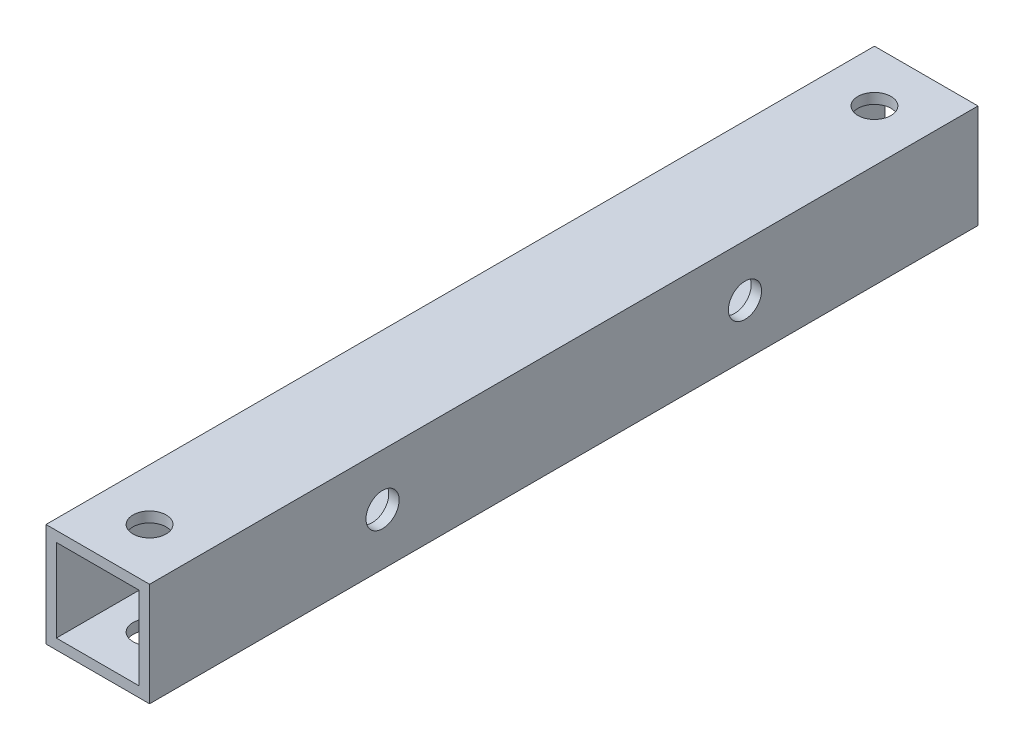
ISO-10303-21;
HEADER;
FILE_DESCRIPTION(('STEP AP214'),'2;1');
FILE_NAME('part.step','',(''),(''),'','','');
FILE_SCHEMA(('AUTOMOTIVE_DESIGN { 1 0 10303 214 1 1 1 1 }'));
ENDSEC;
DATA;
#1=APPLICATION_CONTEXT('core data for automotive mechanical design processes');
#2=APPLICATION_PROTOCOL_DEFINITION('international standard','automotive_design',2000,#1);
#3=PRODUCT_CONTEXT('',#1,'mechanical');
#4=PRODUCT('Part','Part','',(#3));
#5=PRODUCT_RELATED_PRODUCT_CATEGORY('part','',(#4));
#6=PRODUCT_DEFINITION_FORMATION('','',#4);
#7=PRODUCT_DEFINITION_CONTEXT('part definition',#1,'design');
#8=PRODUCT_DEFINITION('design','',#6,#7);
#9=PRODUCT_DEFINITION_SHAPE('','',#8);
#10=(LENGTH_UNIT() NAMED_UNIT(*) SI_UNIT(.MILLI.,.METRE.));
#11=(NAMED_UNIT(*) PLANE_ANGLE_UNIT() SI_UNIT($,.RADIAN.));
#12=(NAMED_UNIT(*) SI_UNIT($,.STERADIAN.) SOLID_ANGLE_UNIT());
#13=UNCERTAINTY_MEASURE_WITH_UNIT(LENGTH_MEASURE(1.E-05),#10,'distance_accuracy_value','');
#14=(GEOMETRIC_REPRESENTATION_CONTEXT(3) GLOBAL_UNCERTAINTY_ASSIGNED_CONTEXT((#13)) GLOBAL_UNIT_ASSIGNED_CONTEXT((#10,
#11,#12)) REPRESENTATION_CONTEXT('',''));
#15=CARTESIAN_POINT('',(0.,0.,0.));
#16=DIRECTION('',(0.,0.,1.));
#17=DIRECTION('',(1.,0.,0.));
#18=AXIS2_PLACEMENT_3D('',#15,#16,#17);
#19=CARTESIAN_POINT('',(0.,0.,80.));
#20=DIRECTION('',(0.,0.,1.));
#21=DIRECTION('',(1.,0.,0.));
#22=AXIS2_PLACEMENT_3D('',#19,#20,#21);
#23=PLANE('',#22);
#24=DIRECTION('',(0.,1.,0.));
#25=VECTOR('',#24,1.);
#26=CARTESIAN_POINT('',(5.,-5.,80.));
#27=LINE('',#26,#25);
#28=CARTESIAN_POINT('',(5.,-5.,80.));
#29=VERTEX_POINT('',#28);
#30=CARTESIAN_POINT('',(5.,5.,80.));
#31=VERTEX_POINT('',#30);
#32=EDGE_CURVE('E162',#29,#31,#27,.T.);
#33=ORIENTED_EDGE('',*,*,#32,.T.);
#34=DIRECTION('',(-1.,0.,0.));
#35=VECTOR('',#34,1.);
#36=CARTESIAN_POINT('',(-5.,5.,80.));
#37=LINE('',#36,#35);
#38=CARTESIAN_POINT('',(-5.,5.,80.));
#39=VERTEX_POINT('',#38);
#40=EDGE_CURVE('E165',#31,#39,#37,.T.);
#41=ORIENTED_EDGE('',*,*,#40,.T.);
#42=DIRECTION('',(0.,-1.,0.));
#43=VECTOR('',#42,1.);
#44=CARTESIAN_POINT('',(-5.,-5.,80.));
#45=LINE('',#44,#43);
#46=CARTESIAN_POINT('',(-5.,-5.,80.));
#47=VERTEX_POINT('',#46);
#48=EDGE_CURVE('E168',#39,#47,#45,.T.);
#49=ORIENTED_EDGE('',*,*,#48,.T.);
#50=DIRECTION('',(1.,0.,0.));
#51=VECTOR('',#50,1.);
#52=CARTESIAN_POINT('',(-5.,-5.,80.));
#53=LINE('',#52,#51);
#54=EDGE_CURVE('E170',#47,#29,#53,.T.);
#55=ORIENTED_EDGE('',*,*,#54,.T.);
#56=EDGE_LOOP('',(#33,#41,#49,#55));
#57=FACE_BOUND('',#56,.T.);
#58=DIRECTION('',(-1.,0.,0.));
#59=VECTOR('',#58,1.);
#60=CARTESIAN_POINT('',(0.,4.,80.));
#61=LINE('',#60,#59);
#62=CARTESIAN_POINT('',(4.,4.,80.));
#63=VERTEX_POINT('',#62);
#64=CARTESIAN_POINT('',(-4.,4.,80.));
#65=VERTEX_POINT('',#64);
#66=EDGE_CURVE('E132',#63,#65,#61,.T.);
#67=ORIENTED_EDGE('',*,*,#66,.F.);
#68=DIRECTION('',(0.,1.,0.));
#69=VECTOR('',#68,1.);
#70=CARTESIAN_POINT('',(4.,0.,80.));
#71=LINE('',#70,#69);
#72=CARTESIAN_POINT('',(4.,-4.,80.));
#73=VERTEX_POINT('',#72);
#74=EDGE_CURVE('E124',#73,#63,#71,.T.);
#75=ORIENTED_EDGE('',*,*,#74,.F.);
#76=DIRECTION('',(1.,0.,0.));
#77=VECTOR('',#76,1.);
#78=CARTESIAN_POINT('',(0.,-4.,80.));
#79=LINE('',#78,#77);
#80=CARTESIAN_POINT('',(-4.,-4.,80.));
#81=VERTEX_POINT('',#80);
#82=EDGE_CURVE('E146',#81,#73,#79,.T.);
#83=ORIENTED_EDGE('',*,*,#82,.F.);
#84=DIRECTION('',(0.,-1.,0.));
#85=VECTOR('',#84,1.);
#86=CARTESIAN_POINT('',(-4.,0.,80.));
#87=LINE('',#86,#85);
#88=EDGE_CURVE('E144',#65,#81,#87,.T.);
#89=ORIENTED_EDGE('',*,*,#88,.F.);
#90=EDGE_LOOP('',(#67,#75,#83,#89));
#91=FACE_BOUND('',#90,.T.);
#92=ADVANCED_FACE('F57',(#57,#91),#23,.T.);
#93=CARTESIAN_POINT('',(0.,0.,0.));
#94=DIRECTION('',(0.,0.,1.));
#95=DIRECTION('',(1.,0.,0.));
#96=AXIS2_PLACEMENT_3D('',#93,#94,#95);
#97=PLANE('',#96);
#98=DIRECTION('',(0.,1.,0.));
#99=VECTOR('',#98,1.);
#100=CARTESIAN_POINT('',(5.,-5.,0.));
#101=LINE('',#100,#99);
#102=CARTESIAN_POINT('',(5.,-5.,0.));
#103=VERTEX_POINT('',#102);
#104=CARTESIAN_POINT('',(5.,5.,0.));
#105=VERTEX_POINT('',#104);
#106=EDGE_CURVE('E140',#103,#105,#101,.T.);
#107=ORIENTED_EDGE('',*,*,#106,.F.);
#108=DIRECTION('',(1.,0.,0.));
#109=VECTOR('',#108,1.);
#110=CARTESIAN_POINT('',(-5.,-5.,0.));
#111=LINE('',#110,#109);
#112=CARTESIAN_POINT('',(-5.,-5.,0.));
#113=VERTEX_POINT('',#112);
#114=EDGE_CURVE('E166',#113,#103,#111,.T.);
#115=ORIENTED_EDGE('',*,*,#114,.F.);
#116=DIRECTION('',(0.,-1.,0.));
#117=VECTOR('',#116,1.);
#118=CARTESIAN_POINT('',(-5.,-5.,0.));
#119=LINE('',#118,#117);
#120=CARTESIAN_POINT('',(-5.,5.,0.));
#121=VERTEX_POINT('',#120);
#122=EDGE_CURVE('E177',#121,#113,#119,.T.);
#123=ORIENTED_EDGE('',*,*,#122,.F.);
#124=DIRECTION('',(-1.,0.,0.));
#125=VECTOR('',#124,1.);
#126=CARTESIAN_POINT('',(-5.,5.,0.));
#127=LINE('',#126,#125);
#128=EDGE_CURVE('E175',#105,#121,#127,.T.);
#129=ORIENTED_EDGE('',*,*,#128,.F.);
#130=EDGE_LOOP('',(#107,#115,#123,#129));
#131=FACE_BOUND('',#130,.T.);
#132=DIRECTION('',(0.,1.,0.));
#133=VECTOR('',#132,1.);
#134=CARTESIAN_POINT('',(4.,0.,0.));
#135=LINE('',#134,#133);
#136=CARTESIAN_POINT('',(4.,-4.,0.));
#137=VERTEX_POINT('',#136);
#138=CARTESIAN_POINT('',(4.,4.,0.));
#139=VERTEX_POINT('',#138);
#140=EDGE_CURVE('E82',#137,#139,#135,.T.);
#141=ORIENTED_EDGE('',*,*,#140,.T.);
#142=DIRECTION('',(-1.,0.,0.));
#143=VECTOR('',#142,1.);
#144=CARTESIAN_POINT('',(0.,4.,0.));
#145=LINE('',#144,#143);
#146=CARTESIAN_POINT('',(-4.,4.,0.));
#147=VERTEX_POINT('',#146);
#148=EDGE_CURVE('E139',#139,#147,#145,.T.);
#149=ORIENTED_EDGE('',*,*,#148,.T.);
#150=DIRECTION('',(0.,-1.,0.));
#151=VECTOR('',#150,1.);
#152=CARTESIAN_POINT('',(-4.,0.,0.));
#153=LINE('',#152,#151);
#154=CARTESIAN_POINT('',(-4.,-4.,0.));
#155=VERTEX_POINT('',#154);
#156=EDGE_CURVE('E154',#147,#155,#153,.T.);
#157=ORIENTED_EDGE('',*,*,#156,.T.);
#158=DIRECTION('',(1.,0.,0.));
#159=VECTOR('',#158,1.);
#160=CARTESIAN_POINT('',(0.,-4.,0.));
#161=LINE('',#160,#159);
#162=EDGE_CURVE('E133',#155,#137,#161,.T.);
#163=ORIENTED_EDGE('',*,*,#162,.T.);
#164=EDGE_LOOP('',(#141,#149,#157,#163));
#165=FACE_BOUND('',#164,.T.);
#166=ADVANCED_FACE('F265',(#131,#165),#97,.F.);
#167=CARTESIAN_POINT('',(5.,-5.,80.));
#168=DIRECTION('',(-1.,0.,0.));
#169=DIRECTION('',(0.,0.,1.));
#170=AXIS2_PLACEMENT_3D('',#167,#168,#169);
#171=PLANE('',#170);
#172=CARTESIAN_POINT('',(5.,0.,22.5));
#173=DIRECTION('',(1.,0.,0.));
#174=DIRECTION('',(0.,0.,-1.));
#175=AXIS2_PLACEMENT_3D('',#172,#173,#174);
#176=CIRCLE('',#175,1.6);
#177=CARTESIAN_POINT('',(5.,0.,20.9));
#178=VERTEX_POINT('',#177);
#179=EDGE_CURVE('E203',#178,#178,#176,.T.);
#180=ORIENTED_EDGE('',*,*,#179,.F.);
#181=EDGE_LOOP('',(#180));
#182=FACE_BOUND('',#181,.T.);
#183=CARTESIAN_POINT('',(5.,0.,57.5));
#184=DIRECTION('',(1.,0.,0.));
#185=DIRECTION('',(0.,0.,1.));
#186=AXIS2_PLACEMENT_3D('',#183,#184,#185);
#187=CIRCLE('',#186,1.60000000000001);
#188=CARTESIAN_POINT('',(5.,0.,59.1));
#189=VERTEX_POINT('',#188);
#190=EDGE_CURVE('E213',#189,#189,#187,.T.);
#191=ORIENTED_EDGE('',*,*,#190,.F.);
#192=EDGE_LOOP('',(#191));
#193=FACE_BOUND('',#192,.T.);
#194=ORIENTED_EDGE('',*,*,#106,.T.);
#195=DIRECTION('',(0.,0.,-1.));
#196=VECTOR('',#195,1.);
#197=CARTESIAN_POINT('',(5.,5.,80.));
#198=LINE('',#197,#196);
#199=EDGE_CURVE('E12',#31,#105,#198,.T.);
#200=ORIENTED_EDGE('',*,*,#199,.F.);
#201=ORIENTED_EDGE('',*,*,#32,.F.);
#202=DIRECTION('',(0.,0.,-1.));
#203=VECTOR('',#202,1.);
#204=CARTESIAN_POINT('',(5.,-5.,80.));
#205=LINE('',#204,#203);
#206=EDGE_CURVE('E172',#29,#103,#205,.T.);
#207=ORIENTED_EDGE('',*,*,#206,.T.);
#208=EDGE_LOOP('',(#194,#200,#201,#207));
#209=FACE_BOUND('',#208,.T.);
#210=ADVANCED_FACE('F59',(#182,#193,#209),#171,.F.);
#211=CARTESIAN_POINT('',(-5.,5.,80.));
#212=DIRECTION('',(0.,-1.,0.));
#213=DIRECTION('',(0.,0.,-1.));
#214=AXIS2_PLACEMENT_3D('',#211,#212,#213);
#215=PLANE('',#214);
#216=CARTESIAN_POINT('',(0.,5.,5.));
#217=DIRECTION('',(0.,1.,0.));
#218=DIRECTION('',(0.,0.,1.));
#219=AXIS2_PLACEMENT_3D('',#216,#217,#218);
#220=CIRCLE('',#219,1.6);
#221=CARTESIAN_POINT('',(0.,5.,6.6));
#222=VERTEX_POINT('',#221);
#223=EDGE_CURVE('E222',#222,#222,#220,.T.);
#224=ORIENTED_EDGE('',*,*,#223,.F.);
#225=EDGE_LOOP('',(#224));
#226=FACE_BOUND('',#225,.T.);
#227=CARTESIAN_POINT('',(0.,5.,75.));
#228=DIRECTION('',(0.,1.,0.));
#229=DIRECTION('',(0.,0.,-1.));
#230=AXIS2_PLACEMENT_3D('',#227,#228,#229);
#231=CIRCLE('',#230,1.6);
#232=CARTESIAN_POINT('',(0.,5.,73.4));
#233=VERTEX_POINT('',#232);
#234=EDGE_CURVE('E219',#233,#233,#231,.T.);
#235=ORIENTED_EDGE('',*,*,#234,.F.);
#236=EDGE_LOOP('',(#235));
#237=FACE_BOUND('',#236,.T.);
#238=ORIENTED_EDGE('',*,*,#128,.T.);
#239=DIRECTION('',(0.,0.,-1.));
#240=VECTOR('',#239,1.);
#241=CARTESIAN_POINT('',(-5.,5.,80.));
#242=LINE('',#241,#240);
#243=EDGE_CURVE('E66',#39,#121,#242,.T.);
#244=ORIENTED_EDGE('',*,*,#243,.F.);
#245=ORIENTED_EDGE('',*,*,#40,.F.);
#246=ORIENTED_EDGE('',*,*,#199,.T.);
#247=EDGE_LOOP('',(#238,#244,#245,#246));
#248=FACE_BOUND('',#247,.T.);
#249=ADVANCED_FACE('F251',(#226,#237,#248),#215,.F.);
#250=CARTESIAN_POINT('',(-5.,-5.,80.));
#251=DIRECTION('',(1.,0.,0.));
#252=DIRECTION('',(0.,0.,-1.));
#253=AXIS2_PLACEMENT_3D('',#250,#251,#252);
#254=PLANE('',#253);
#255=CARTESIAN_POINT('',(-5.,0.,22.5));
#256=DIRECTION('',(1.,0.,0.));
#257=DIRECTION('',(0.,0.,-1.));
#258=AXIS2_PLACEMENT_3D('',#255,#256,#257);
#259=CIRCLE('',#258,1.6);
#260=CARTESIAN_POINT('',(-5.,0.,20.9));
#261=VERTEX_POINT('',#260);
#262=EDGE_CURVE('E197',#261,#261,#259,.T.);
#263=ORIENTED_EDGE('',*,*,#262,.T.);
#264=EDGE_LOOP('',(#263));
#265=FACE_BOUND('',#264,.T.);
#266=CARTESIAN_POINT('',(-5.,0.,57.5));
#267=DIRECTION('',(1.,0.,0.));
#268=DIRECTION('',(0.,0.,1.));
#269=AXIS2_PLACEMENT_3D('',#266,#267,#268);
#270=CIRCLE('',#269,1.60000000000001);
#271=CARTESIAN_POINT('',(-5.,0.,59.1));
#272=VERTEX_POINT('',#271);
#273=EDGE_CURVE('E208',#272,#272,#270,.T.);
#274=ORIENTED_EDGE('',*,*,#273,.T.);
#275=EDGE_LOOP('',(#274));
#276=FACE_BOUND('',#275,.T.);
#277=ORIENTED_EDGE('',*,*,#122,.T.);
#278=DIRECTION('',(0.,0.,-1.));
#279=VECTOR('',#278,1.);
#280=CARTESIAN_POINT('',(-5.,-5.,80.));
#281=LINE('',#280,#279);
#282=EDGE_CURVE('E182',#47,#113,#281,.T.);
#283=ORIENTED_EDGE('',*,*,#282,.F.);
#284=ORIENTED_EDGE('',*,*,#48,.F.);
#285=ORIENTED_EDGE('',*,*,#243,.T.);
#286=EDGE_LOOP('',(#277,#283,#284,#285));
#287=FACE_BOUND('',#286,.T.);
#288=ADVANCED_FACE('F254',(#265,#276,#287),#254,.F.);
#289=CARTESIAN_POINT('',(-5.,-5.,80.));
#290=DIRECTION('',(0.,1.,0.));
#291=DIRECTION('',(0.,0.,1.));
#292=AXIS2_PLACEMENT_3D('',#289,#290,#291);
#293=PLANE('',#292);
#294=CARTESIAN_POINT('',(0.,-5.,5.));
#295=DIRECTION('',(0.,1.,0.));
#296=DIRECTION('',(0.,0.,1.));
#297=AXIS2_PLACEMENT_3D('',#294,#295,#296);
#298=CIRCLE('',#297,1.6);
#299=CARTESIAN_POINT('',(0.,-5.,6.6));
#300=VERTEX_POINT('',#299);
#301=EDGE_CURVE('E191',#300,#300,#298,.T.);
#302=ORIENTED_EDGE('',*,*,#301,.T.);
#303=EDGE_LOOP('',(#302));
#304=FACE_BOUND('',#303,.T.);
#305=CARTESIAN_POINT('',(0.,-5.,75.));
#306=DIRECTION('',(0.,1.,0.));
#307=DIRECTION('',(0.,0.,-1.));
#308=AXIS2_PLACEMENT_3D('',#305,#306,#307);
#309=CIRCLE('',#308,1.6);
#310=CARTESIAN_POINT('',(0.,-5.,73.4));
#311=VERTEX_POINT('',#310);
#312=EDGE_CURVE('E225',#311,#311,#309,.T.);
#313=ORIENTED_EDGE('',*,*,#312,.T.);
#314=EDGE_LOOP('',(#313));
#315=FACE_BOUND('',#314,.T.);
#316=ORIENTED_EDGE('',*,*,#114,.T.);
#317=ORIENTED_EDGE('',*,*,#206,.F.);
#318=ORIENTED_EDGE('',*,*,#54,.F.);
#319=ORIENTED_EDGE('',*,*,#282,.T.);
#320=EDGE_LOOP('',(#316,#317,#318,#319));
#321=FACE_BOUND('',#320,.T.);
#322=ADVANCED_FACE('F269',(#304,#315,#321),#293,.F.);
#323=CARTESIAN_POINT('',(4.,0.,80.));
#324=DIRECTION('',(-1.,0.,0.));
#325=DIRECTION('',(0.,0.,1.));
#326=AXIS2_PLACEMENT_3D('',#323,#324,#325);
#327=PLANE('',#326);
#328=CARTESIAN_POINT('',(4.,0.,22.5));
#329=DIRECTION('',(-1.,0.,0.));
#330=DIRECTION('',(0.,0.,1.));
#331=AXIS2_PLACEMENT_3D('',#328,#329,#330);
#332=CIRCLE('',#331,1.6);
#333=CARTESIAN_POINT('',(4.,0.,24.1));
#334=VERTEX_POINT('',#333);
#335=EDGE_CURVE('E216',#334,#334,#332,.T.);
#336=ORIENTED_EDGE('',*,*,#335,.F.);
#337=EDGE_LOOP('',(#336));
#338=FACE_BOUND('',#337,.T.);
#339=CARTESIAN_POINT('',(4.,0.,57.5));
#340=DIRECTION('',(-1.,0.,0.));
#341=DIRECTION('',(0.,0.,1.));
#342=AXIS2_PLACEMENT_3D('',#339,#340,#341);
#343=CIRCLE('',#342,1.60000000000001);
#344=CARTESIAN_POINT('',(4.,0.,59.1));
#345=VERTEX_POINT('',#344);
#346=EDGE_CURVE('E196',#345,#345,#343,.T.);
#347=ORIENTED_EDGE('',*,*,#346,.F.);
#348=EDGE_LOOP('',(#347));
#349=FACE_BOUND('',#348,.T.);
#350=ORIENTED_EDGE('',*,*,#140,.F.);
#351=DIRECTION('',(0.,0.,-1.));
#352=VECTOR('',#351,1.);
#353=CARTESIAN_POINT('',(4.,-4.,80.));
#354=LINE('',#353,#352);
#355=EDGE_CURVE('E128',#73,#137,#354,.T.);
#356=ORIENTED_EDGE('',*,*,#355,.F.);
#357=ORIENTED_EDGE('',*,*,#74,.T.);
#358=DIRECTION('',(0.,0.,-1.));
#359=VECTOR('',#358,1.);
#360=CARTESIAN_POINT('',(4.,4.,80.));
#361=LINE('',#360,#359);
#362=EDGE_CURVE('E127',#63,#139,#361,.T.);
#363=ORIENTED_EDGE('',*,*,#362,.T.);
#364=EDGE_LOOP('',(#350,#356,#357,#363));
#365=FACE_BOUND('',#364,.T.);
#366=ADVANCED_FACE('F126',(#338,#349,#365),#327,.T.);
#367=CARTESIAN_POINT('',(0.,4.,80.));
#368=DIRECTION('',(0.,-1.,0.));
#369=DIRECTION('',(0.,0.,-1.));
#370=AXIS2_PLACEMENT_3D('',#367,#368,#369);
#371=PLANE('',#370);
#372=CARTESIAN_POINT('',(0.,4.,5.));
#373=DIRECTION('',(0.,-1.,0.));
#374=DIRECTION('',(0.,0.,-1.));
#375=AXIS2_PLACEMENT_3D('',#372,#373,#374);
#376=CIRCLE('',#375,1.6);
#377=CARTESIAN_POINT('',(0.,4.,3.4));
#378=VERTEX_POINT('',#377);
#379=EDGE_CURVE('E152',#378,#378,#376,.T.);
#380=ORIENTED_EDGE('',*,*,#379,.F.);
#381=EDGE_LOOP('',(#380));
#382=FACE_BOUND('',#381,.T.);
#383=CARTESIAN_POINT('',(0.,4.,75.));
#384=DIRECTION('',(0.,-1.,0.));
#385=DIRECTION('',(0.,0.,-1.));
#386=AXIS2_PLACEMENT_3D('',#383,#384,#385);
#387=CIRCLE('',#386,1.6);
#388=CARTESIAN_POINT('',(0.,4.,73.4));
#389=VERTEX_POINT('',#388);
#390=EDGE_CURVE('E190',#389,#389,#387,.T.);
#391=ORIENTED_EDGE('',*,*,#390,.F.);
#392=EDGE_LOOP('',(#391));
#393=FACE_BOUND('',#392,.T.);
#394=ORIENTED_EDGE('',*,*,#148,.F.);
#395=ORIENTED_EDGE('',*,*,#362,.F.);
#396=ORIENTED_EDGE('',*,*,#66,.T.);
#397=DIRECTION('',(0.,0.,-1.));
#398=VECTOR('',#397,1.);
#399=CARTESIAN_POINT('',(-4.,4.,80.));
#400=LINE('',#399,#398);
#401=EDGE_CURVE('E141',#65,#147,#400,.T.);
#402=ORIENTED_EDGE('',*,*,#401,.T.);
#403=EDGE_LOOP('',(#394,#395,#396,#402));
#404=FACE_BOUND('',#403,.T.);
#405=ADVANCED_FACE('F136',(#382,#393,#404),#371,.T.);
#406=CARTESIAN_POINT('',(-4.,0.,80.));
#407=DIRECTION('',(1.,0.,0.));
#408=DIRECTION('',(0.,0.,-1.));
#409=AXIS2_PLACEMENT_3D('',#406,#407,#408);
#410=PLANE('',#409);
#411=CARTESIAN_POINT('',(-4.,0.,22.5));
#412=DIRECTION('',(1.,0.,0.));
#413=DIRECTION('',(0.,0.,-1.));
#414=AXIS2_PLACEMENT_3D('',#411,#412,#413);
#415=CIRCLE('',#414,1.6);
#416=CARTESIAN_POINT('',(-4.,0.,20.9));
#417=VERTEX_POINT('',#416);
#418=EDGE_CURVE('E61',#417,#417,#415,.T.);
#419=ORIENTED_EDGE('',*,*,#418,.F.);
#420=EDGE_LOOP('',(#419));
#421=FACE_BOUND('',#420,.T.);
#422=CARTESIAN_POINT('',(-4.,0.,57.5));
#423=DIRECTION('',(1.,0.,0.));
#424=DIRECTION('',(0.,0.,-1.));
#425=AXIS2_PLACEMENT_3D('',#422,#423,#424);
#426=CIRCLE('',#425,1.60000000000001);
#427=CARTESIAN_POINT('',(-4.,0.,55.9));
#428=VERTEX_POINT('',#427);
#429=EDGE_CURVE('E194',#428,#428,#426,.T.);
#430=ORIENTED_EDGE('',*,*,#429,.F.);
#431=EDGE_LOOP('',(#430));
#432=FACE_BOUND('',#431,.T.);
#433=ORIENTED_EDGE('',*,*,#156,.F.);
#434=ORIENTED_EDGE('',*,*,#401,.F.);
#435=ORIENTED_EDGE('',*,*,#88,.T.);
#436=DIRECTION('',(0.,0.,-1.));
#437=VECTOR('',#436,1.);
#438=CARTESIAN_POINT('',(-4.,-4.,80.));
#439=LINE('',#438,#437);
#440=EDGE_CURVE('E74',#81,#155,#439,.T.);
#441=ORIENTED_EDGE('',*,*,#440,.T.);
#442=EDGE_LOOP('',(#433,#434,#435,#441));
#443=FACE_BOUND('',#442,.T.);
#444=ADVANCED_FACE('F239',(#421,#432,#443),#410,.T.);
#445=CARTESIAN_POINT('',(0.,-4.,80.));
#446=DIRECTION('',(0.,1.,0.));
#447=DIRECTION('',(0.,0.,1.));
#448=AXIS2_PLACEMENT_3D('',#445,#446,#447);
#449=PLANE('',#448);
#450=CARTESIAN_POINT('',(0.,-4.,5.));
#451=DIRECTION('',(0.,1.,0.));
#452=DIRECTION('',(0.,0.,1.));
#453=AXIS2_PLACEMENT_3D('',#450,#451,#452);
#454=CIRCLE('',#453,1.6);
#455=CARTESIAN_POINT('',(0.,-4.,6.6));
#456=VERTEX_POINT('',#455);
#457=EDGE_CURVE('E192',#456,#456,#454,.T.);
#458=ORIENTED_EDGE('',*,*,#457,.F.);
#459=EDGE_LOOP('',(#458));
#460=FACE_BOUND('',#459,.T.);
#461=CARTESIAN_POINT('',(0.,-4.,75.));
#462=DIRECTION('',(0.,1.,0.));
#463=DIRECTION('',(0.,0.,1.));
#464=AXIS2_PLACEMENT_3D('',#461,#462,#463);
#465=CIRCLE('',#464,1.6);
#466=CARTESIAN_POINT('',(0.,-4.,76.6));
#467=VERTEX_POINT('',#466);
#468=EDGE_CURVE('E187',#467,#467,#465,.T.);
#469=ORIENTED_EDGE('',*,*,#468,.F.);
#470=EDGE_LOOP('',(#469));
#471=FACE_BOUND('',#470,.T.);
#472=ORIENTED_EDGE('',*,*,#162,.F.);
#473=ORIENTED_EDGE('',*,*,#440,.F.);
#474=ORIENTED_EDGE('',*,*,#82,.T.);
#475=ORIENTED_EDGE('',*,*,#355,.T.);
#476=EDGE_LOOP('',(#472,#473,#474,#475));
#477=FACE_BOUND('',#476,.T.);
#478=ADVANCED_FACE('F351',(#460,#471,#477),#449,.T.);
#479=CARTESIAN_POINT('',(0.,-5.,75.));
#480=DIRECTION('',(0.,1.,0.));
#481=DIRECTION('',(0.,0.,1.));
#482=AXIS2_PLACEMENT_3D('',#479,#480,#481);
#483=CYLINDRICAL_SURFACE('',#482,1.6);
#484=ORIENTED_EDGE('',*,*,#468,.T.);
#485=EDGE_LOOP('',(#484));
#486=FACE_BOUND('',#485,.T.);
#487=ORIENTED_EDGE('',*,*,#312,.F.);
#488=EDGE_LOOP('',(#487));
#489=FACE_BOUND('',#488,.T.);
#490=ADVANCED_FACE('F248',(#486,#489),#483,.F.);
#491=CARTESIAN_POINT('',(0.,-5.,5.));
#492=DIRECTION('',(0.,1.,0.));
#493=DIRECTION('',(0.,0.,1.));
#494=AXIS2_PLACEMENT_3D('',#491,#492,#493);
#495=CYLINDRICAL_SURFACE('',#494,1.6);
#496=ORIENTED_EDGE('',*,*,#457,.T.);
#497=EDGE_LOOP('',(#496));
#498=FACE_BOUND('',#497,.T.);
#499=ORIENTED_EDGE('',*,*,#301,.F.);
#500=EDGE_LOOP('',(#499));
#501=FACE_BOUND('',#500,.T.);
#502=ADVANCED_FACE('F246',(#498,#501),#495,.F.);
#503=ORIENTED_EDGE('',*,*,#390,.T.);
#504=EDGE_LOOP('',(#503));
#505=FACE_BOUND('',#504,.T.);
#506=ORIENTED_EDGE('',*,*,#234,.T.);
#507=EDGE_LOOP('',(#506));
#508=FACE_BOUND('',#507,.T.);
#509=ADVANCED_FACE('F243',(#505,#508),#483,.F.);
#510=ORIENTED_EDGE('',*,*,#379,.T.);
#511=EDGE_LOOP('',(#510));
#512=FACE_BOUND('',#511,.T.);
#513=ORIENTED_EDGE('',*,*,#223,.T.);
#514=EDGE_LOOP('',(#513));
#515=FACE_BOUND('',#514,.T.);
#516=ADVANCED_FACE('F234',(#512,#515),#495,.F.);
#517=CARTESIAN_POINT('',(-5.,0.,57.5));
#518=DIRECTION('',(1.,0.,0.));
#519=DIRECTION('',(0.,0.,-1.));
#520=AXIS2_PLACEMENT_3D('',#517,#518,#519);
#521=CYLINDRICAL_SURFACE('',#520,1.60000000000001);
#522=ORIENTED_EDGE('',*,*,#429,.T.);
#523=EDGE_LOOP('',(#522));
#524=FACE_BOUND('',#523,.T.);
#525=ORIENTED_EDGE('',*,*,#273,.F.);
#526=EDGE_LOOP('',(#525));
#527=FACE_BOUND('',#526,.T.);
#528=ADVANCED_FACE('F291',(#524,#527),#521,.F.);
#529=CARTESIAN_POINT('',(-5.,0.,22.5));
#530=DIRECTION('',(1.,0.,0.));
#531=DIRECTION('',(0.,0.,-1.));
#532=AXIS2_PLACEMENT_3D('',#529,#530,#531);
#533=CYLINDRICAL_SURFACE('',#532,1.6);
#534=ORIENTED_EDGE('',*,*,#418,.T.);
#535=EDGE_LOOP('',(#534));
#536=FACE_BOUND('',#535,.T.);
#537=ORIENTED_EDGE('',*,*,#262,.F.);
#538=EDGE_LOOP('',(#537));
#539=FACE_BOUND('',#538,.T.);
#540=ADVANCED_FACE('F293',(#536,#539),#533,.F.);
#541=ORIENTED_EDGE('',*,*,#346,.T.);
#542=EDGE_LOOP('',(#541));
#543=FACE_BOUND('',#542,.T.);
#544=ORIENTED_EDGE('',*,*,#190,.T.);
#545=EDGE_LOOP('',(#544));
#546=FACE_BOUND('',#545,.T.);
#547=ADVANCED_FACE('F295',(#543,#546),#521,.F.);
#548=ORIENTED_EDGE('',*,*,#335,.T.);
#549=EDGE_LOOP('',(#548));
#550=FACE_BOUND('',#549,.T.);
#551=ORIENTED_EDGE('',*,*,#179,.T.);
#552=EDGE_LOOP('',(#551));
#553=FACE_BOUND('',#552,.T.);
#554=ADVANCED_FACE('F302',(#550,#553),#533,.F.);
#555=CLOSED_SHELL('',(#92,#166,#210,#249,#288,#322,#366,#405,#444,#478,#490,#502,#509,#516,#528,
#540,#547,#554));
#556=MANIFOLD_SOLID_BREP('B2',#555);
#557=ADVANCED_BREP_SHAPE_REPRESENTATION('',(#18,#556),#14);
#558=SHAPE_DEFINITION_REPRESENTATION(#9,#557);
ENDSEC;
END-ISO-10303-21;
